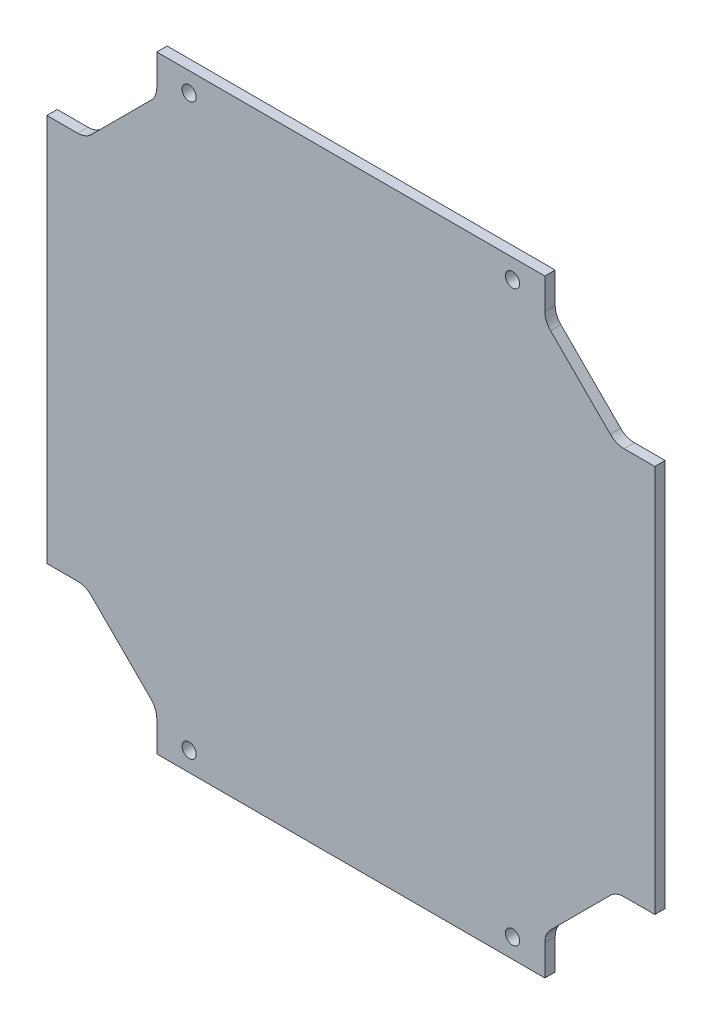
ISO-10303-21;
HEADER;
FILE_DESCRIPTION(('STEP AP214'),'2;1');
FILE_NAME('part.step','',(''),(''),'','','');
FILE_SCHEMA(('AUTOMOTIVE_DESIGN { 1 0 10303 214 1 1 1 1 }'));
ENDSEC;
DATA;
#1=APPLICATION_CONTEXT('core data for automotive mechanical design processes');
#2=APPLICATION_PROTOCOL_DEFINITION('international standard','automotive_design',2000,#1);
#3=PRODUCT_CONTEXT('',#1,'mechanical');
#4=PRODUCT('Part','Part','',(#3));
#5=PRODUCT_RELATED_PRODUCT_CATEGORY('part','',(#4));
#6=PRODUCT_DEFINITION_FORMATION('','',#4);
#7=PRODUCT_DEFINITION_CONTEXT('part definition',#1,'design');
#8=PRODUCT_DEFINITION('design','',#6,#7);
#9=PRODUCT_DEFINITION_SHAPE('','',#8);
#10=(LENGTH_UNIT() NAMED_UNIT(*) SI_UNIT(.MILLI.,.METRE.));
#11=(NAMED_UNIT(*) PLANE_ANGLE_UNIT() SI_UNIT($,.RADIAN.));
#12=(NAMED_UNIT(*) SI_UNIT($,.STERADIAN.) SOLID_ANGLE_UNIT());
#13=UNCERTAINTY_MEASURE_WITH_UNIT(LENGTH_MEASURE(1.E-05),#10,'distance_accuracy_value','');
#14=(GEOMETRIC_REPRESENTATION_CONTEXT(3) GLOBAL_UNCERTAINTY_ASSIGNED_CONTEXT((#13)) GLOBAL_UNIT_ASSIGNED_CONTEXT((#10,
#11,#12)) REPRESENTATION_CONTEXT('',''));
#15=CARTESIAN_POINT('',(0.,0.,0.));
#16=DIRECTION('',(0.,0.,1.));
#17=DIRECTION('',(1.,0.,0.));
#18=AXIS2_PLACEMENT_3D('',#15,#16,#17);
#19=CARTESIAN_POINT('',(-69.5653438799531,14.9518569300748,1.6));
#20=DIRECTION('',(0.,0.,-1.));
#21=DIRECTION('',(-1.,0.,0.));
#22=AXIS2_PLACEMENT_3D('',#19,#20,#21);
#23=PLANE('',#22);
#24=CARTESIAN_POINT('',(-14.5653438799531,88.9518569300749,1.6));
#25=DIRECTION('',(0.,0.,1.));
#26=DIRECTION('',(1.,0.,0.));
#27=AXIS2_PLACEMENT_3D('',#24,#25,#26);
#28=CIRCLE('',#27,1.1);
#29=CARTESIAN_POINT('',(-13.4653438799531,88.9518569300749,1.6));
#30=VERTEX_POINT('',#29);
#31=EDGE_CURVE('E730',#30,#30,#28,.T.);
#32=ORIENTED_EDGE('',*,*,#31,.F.);
#33=EDGE_LOOP('',(#32));
#34=FACE_BOUND('',#33,.T.);
#35=CARTESIAN_POINT('',(-64.5653438799532,88.9518569300749,1.6));
#36=DIRECTION('',(0.,0.,1.));
#37=DIRECTION('',(1.,0.,0.));
#38=AXIS2_PLACEMENT_3D('',#35,#36,#37);
#39=CIRCLE('',#38,1.10000000000001);
#40=CARTESIAN_POINT('',(-63.4653438799532,88.9518569300749,1.6));
#41=VERTEX_POINT('',#40);
#42=EDGE_CURVE('E257',#41,#41,#39,.T.);
#43=ORIENTED_EDGE('',*,*,#42,.F.);
#44=EDGE_LOOP('',(#43));
#45=FACE_BOUND('',#44,.T.);
#46=DIRECTION('',(1.,0.,0.));
#47=VECTOR('',#46,1.);
#48=CARTESIAN_POINT('',(-86.5653438799531,14.9518569300748,1.6));
#49=LINE('',#48,#47);
#50=CARTESIAN_POINT('',(-86.5653438799531,14.9518569300748,1.6));
#51=VERTEX_POINT('',#50);
#52=CARTESIAN_POINT('',(-81.8079845670724,14.9518569300748,1.6));
#53=VERTEX_POINT('',#52);
#54=EDGE_CURVE('E292',#51,#53,#49,.T.);
#55=ORIENTED_EDGE('',*,*,#54,.T.);
#56=CARTESIAN_POINT('',(-81.8079845670724,11.9518569300748,1.6));
#57=DIRECTION('',(0.,0.,-1.));
#58=DIRECTION('',(-1.,0.,0.));
#59=AXIS2_PLACEMENT_3D('',#56,#57,#58);
#60=CIRCLE('',#59,3.);
#61=CARTESIAN_POINT('',(-79.6866642235128,14.0731772736345,1.6));
#62=VERTEX_POINT('',#61);
#63=EDGE_CURVE('E350',#53,#62,#60,.T.);
#64=ORIENTED_EDGE('',*,*,#63,.T.);
#65=DIRECTION('',(0.707106781186547,-0.707106781186547,0.));
#66=VECTOR('',#65,1.);
#67=CARTESIAN_POINT('',(-80.5653438799531,14.9518569300748,1.6));
#68=LINE('',#67,#66);
#69=CARTESIAN_POINT('',(-70.4440235363935,4.83053658651517,1.6));
#70=VERTEX_POINT('',#69);
#71=EDGE_CURVE('E206',#62,#70,#68,.T.);
#72=ORIENTED_EDGE('',*,*,#71,.T.);
#73=CARTESIAN_POINT('',(-72.5653438799532,2.70921624295552,1.6));
#74=DIRECTION('',(0.,0.,-1.));
#75=DIRECTION('',(-1.,0.,0.));
#76=AXIS2_PLACEMENT_3D('',#73,#74,#75);
#77=CIRCLE('',#76,3.);
#78=CARTESIAN_POINT('',(-69.5653438799531,2.70921624295552,1.6));
#79=VERTEX_POINT('',#78);
#80=EDGE_CURVE('E202',#70,#79,#77,.T.);
#81=ORIENTED_EDGE('',*,*,#80,.T.);
#82=DIRECTION('',(0.,-1.,0.));
#83=VECTOR('',#82,1.);
#84=CARTESIAN_POINT('',(-69.5653438799531,3.95185693007481,1.6));
#85=LINE('',#84,#83);
#86=CARTESIAN_POINT('',(-69.5653438799531,-2.04814306992522,1.6));
#87=VERTEX_POINT('',#86);
#88=EDGE_CURVE('E192',#79,#87,#85,.T.);
#89=ORIENTED_EDGE('',*,*,#88,.T.);
#90=DIRECTION('',(1.,0.,0.));
#91=VECTOR('',#90,1.);
#92=CARTESIAN_POINT('',(-69.5653438799531,-2.04814306992522,1.6));
#93=LINE('',#92,#91);
#94=CARTESIAN_POINT('',(-9.56534387995308,-2.04814306992519,1.6));
#95=VERTEX_POINT('',#94);
#96=EDGE_CURVE('E198',#87,#95,#93,.T.);
#97=ORIENTED_EDGE('',*,*,#96,.T.);
#98=DIRECTION('',(0.,1.,0.));
#99=VECTOR('',#98,1.);
#100=CARTESIAN_POINT('',(-9.56534387995305,3.95185693007478,1.6));
#101=LINE('',#100,#99);
#102=CARTESIAN_POINT('',(-9.56534387995306,2.70921624295551,1.6));
#103=VERTEX_POINT('',#102);
#104=EDGE_CURVE('E221',#95,#103,#101,.T.);
#105=ORIENTED_EDGE('',*,*,#104,.T.);
#106=CARTESIAN_POINT('',(-6.56534387995306,2.7092162429555,1.6));
#107=DIRECTION('',(0.,0.,-1.));
#108=DIRECTION('',(-1.,0.,0.));
#109=AXIS2_PLACEMENT_3D('',#106,#107,#108);
#110=CIRCLE('',#109,3.);
#111=CARTESIAN_POINT('',(-8.68666422351271,4.83053658651513,1.6));
#112=VERTEX_POINT('',#111);
#113=EDGE_CURVE('E357',#103,#112,#110,.T.);
#114=ORIENTED_EDGE('',*,*,#113,.T.);
#115=DIRECTION('',(0.707106781186545,0.70710678118655,0.));
#116=VECTOR('',#115,1.);
#117=CARTESIAN_POINT('',(-9.56534387995305,3.95185693007478,1.6));
#118=LINE('',#117,#116);
#119=CARTESIAN_POINT('',(0.555976463606556,14.0731772736345,1.6));
#120=VERTEX_POINT('',#119);
#121=EDGE_CURVE('E223',#112,#120,#118,.T.);
#122=ORIENTED_EDGE('',*,*,#121,.T.);
#123=CARTESIAN_POINT('',(2.67729680716621,11.9518569300748,1.6));
#124=DIRECTION('',(0.,0.,-1.));
#125=DIRECTION('',(-1.,0.,0.));
#126=AXIS2_PLACEMENT_3D('',#123,#124,#125);
#127=CIRCLE('',#126,3.);
#128=CARTESIAN_POINT('',(2.67729680716621,14.9518569300748,1.6));
#129=VERTEX_POINT('',#128);
#130=EDGE_CURVE('E361',#120,#129,#127,.T.);
#131=ORIENTED_EDGE('',*,*,#130,.T.);
#132=DIRECTION('',(1.,0.,0.));
#133=VECTOR('',#132,1.);
#134=CARTESIAN_POINT('',(7.43465612004692,14.9518569300748,1.6));
#135=LINE('',#134,#133);
#136=CARTESIAN_POINT('',(7.43465612004692,14.9518569300748,1.6));
#137=VERTEX_POINT('',#136);
#138=EDGE_CURVE('E229',#129,#137,#135,.T.);
#139=ORIENTED_EDGE('',*,*,#138,.T.);
#140=DIRECTION('',(0.,1.,0.));
#141=VECTOR('',#140,1.);
#142=CARTESIAN_POINT('',(7.43465612004692,74.9518569300749,1.6));
#143=LINE('',#142,#141);
#144=CARTESIAN_POINT('',(7.43465612004692,74.9518569300749,1.6));
#145=VERTEX_POINT('',#144);
#146=EDGE_CURVE('E231',#137,#145,#143,.T.);
#147=ORIENTED_EDGE('',*,*,#146,.T.);
#148=DIRECTION('',(-1.,0.,0.));
#149=VECTOR('',#148,1.);
#150=CARTESIAN_POINT('',(1.43465612004691,74.9518569300749,1.6));
#151=LINE('',#150,#149);
#152=CARTESIAN_POINT('',(2.67729680716619,74.9518569300749,1.6));
#153=VERTEX_POINT('',#152);
#154=EDGE_CURVE('E233',#145,#153,#151,.T.);
#155=ORIENTED_EDGE('',*,*,#154,.T.);
#156=CARTESIAN_POINT('',(2.67729680716619,77.9518569300749,1.6));
#157=DIRECTION('',(0.,0.,-1.));
#158=DIRECTION('',(-1.,0.,0.));
#159=AXIS2_PLACEMENT_3D('',#156,#157,#158);
#160=CIRCLE('',#159,3.);
#161=CARTESIAN_POINT('',(0.555976463606544,75.8305365865153,1.6));
#162=VERTEX_POINT('',#161);
#163=EDGE_CURVE('E369',#153,#162,#160,.T.);
#164=ORIENTED_EDGE('',*,*,#163,.T.);
#165=DIRECTION('',(-0.707106781186547,0.707106781186548,0.));
#166=VECTOR('',#165,1.);
#167=CARTESIAN_POINT('',(-9.56534387995309,85.9518569300749,1.6));
#168=LINE('',#167,#166);
#169=CARTESIAN_POINT('',(-8.68666422351274,85.0731772736346,1.6));
#170=VERTEX_POINT('',#169);
#171=EDGE_CURVE('E236',#162,#170,#168,.T.);
#172=ORIENTED_EDGE('',*,*,#171,.T.);
#173=CARTESIAN_POINT('',(-6.56534387995309,87.1944976171942,1.6));
#174=DIRECTION('',(0.,0.,-1.));
#175=DIRECTION('',(-1.,0.,0.));
#176=AXIS2_PLACEMENT_3D('',#173,#174,#175);
#177=CIRCLE('',#176,3.);
#178=CARTESIAN_POINT('',(-9.56534387995309,87.1944976171942,1.6));
#179=VERTEX_POINT('',#178);
#180=EDGE_CURVE('E365',#170,#179,#177,.T.);
#181=ORIENTED_EDGE('',*,*,#180,.T.);
#182=DIRECTION('',(0.,1.,0.));
#183=VECTOR('',#182,1.);
#184=CARTESIAN_POINT('',(-9.56534387995309,91.9518569300749,1.6));
#185=LINE('',#184,#183);
#186=CARTESIAN_POINT('',(-9.56534387995309,91.9518569300749,1.6));
#187=VERTEX_POINT('',#186);
#188=EDGE_CURVE('E239',#179,#187,#185,.T.);
#189=ORIENTED_EDGE('',*,*,#188,.T.);
#190=DIRECTION('',(-1.,0.,0.));
#191=VECTOR('',#190,1.);
#192=CARTESIAN_POINT('',(-69.5653438799531,91.9518569300749,1.6));
#193=LINE('',#192,#191);
#194=CARTESIAN_POINT('',(-69.5653438799531,91.9518569300749,1.6));
#195=VERTEX_POINT('',#194);
#196=EDGE_CURVE('E241',#187,#195,#193,.T.);
#197=ORIENTED_EDGE('',*,*,#196,.T.);
#198=DIRECTION('',(0.,-1.,0.));
#199=VECTOR('',#198,1.);
#200=CARTESIAN_POINT('',(-69.5653438799531,85.9518569300749,1.6));
#201=LINE('',#200,#199);
#202=CARTESIAN_POINT('',(-69.5653438799531,87.1944976171942,1.6));
#203=VERTEX_POINT('',#202);
#204=EDGE_CURVE('E243',#195,#203,#201,.T.);
#205=ORIENTED_EDGE('',*,*,#204,.T.);
#206=CARTESIAN_POINT('',(-72.5653438799532,87.1944976171942,1.6));
#207=DIRECTION('',(0.,0.,-1.));
#208=DIRECTION('',(-1.,0.,0.));
#209=AXIS2_PLACEMENT_3D('',#206,#207,#208);
#210=CIRCLE('',#209,3.);
#211=CARTESIAN_POINT('',(-70.4440235363935,85.0731772736345,1.6));
#212=VERTEX_POINT('',#211);
#213=EDGE_CURVE('E11',#203,#212,#210,.T.);
#214=ORIENTED_EDGE('',*,*,#213,.T.);
#215=DIRECTION('',(-0.707106781186547,-0.707106781186547,0.));
#216=VECTOR('',#215,1.);
#217=CARTESIAN_POINT('',(-80.5653438799531,74.9518569300749,1.6));
#218=LINE('',#217,#216);
#219=CARTESIAN_POINT('',(-79.6866642235128,75.8305365865153,1.6));
#220=VERTEX_POINT('',#219);
#221=EDGE_CURVE('E245',#212,#220,#218,.T.);
#222=ORIENTED_EDGE('',*,*,#221,.T.);
#223=CARTESIAN_POINT('',(-81.8079845670724,77.9518569300749,1.6));
#224=DIRECTION('',(0.,0.,-1.));
#225=DIRECTION('',(-1.,0.,0.));
#226=AXIS2_PLACEMENT_3D('',#223,#224,#225);
#227=CIRCLE('',#226,3.);
#228=CARTESIAN_POINT('',(-81.8079845670724,74.9518569300749,1.6));
#229=VERTEX_POINT('',#228);
#230=EDGE_CURVE('E373',#220,#229,#227,.T.);
#231=ORIENTED_EDGE('',*,*,#230,.T.);
#232=DIRECTION('',(-1.,0.,0.));
#233=VECTOR('',#232,1.);
#234=CARTESIAN_POINT('',(-86.5653438799532,74.9518569300749,1.6));
#235=LINE('',#234,#233);
#236=CARTESIAN_POINT('',(-86.5653438799532,74.9518569300749,1.6));
#237=VERTEX_POINT('',#236);
#238=EDGE_CURVE('E248',#229,#237,#235,.T.);
#239=ORIENTED_EDGE('',*,*,#238,.T.);
#240=DIRECTION('',(0.,-1.,0.));
#241=VECTOR('',#240,1.);
#242=CARTESIAN_POINT('',(-86.5653438799532,74.9518569300749,1.6));
#243=LINE('',#242,#241);
#244=EDGE_CURVE('E250',#237,#51,#243,.T.);
#245=ORIENTED_EDGE('',*,*,#244,.T.);
#246=EDGE_LOOP('',(#55,#64,#72,#81,#89,#97,#105,#114,#122,#131,#139,#147,#155,#164,#172,#181,
#189,#197,#205,#214,#222,#231,#239,#245));
#247=FACE_BOUND('',#246,.T.);
#248=CARTESIAN_POINT('',(-64.5653438799531,0.951856930074832,1.6));
#249=DIRECTION('',(0.,0.,1.));
#250=DIRECTION('',(1.,0.,0.));
#251=AXIS2_PLACEMENT_3D('',#248,#249,#250);
#252=CIRCLE('',#251,1.10000000000001);
#253=CARTESIAN_POINT('',(-63.4653438799531,0.951856930074832,1.6));
#254=VERTEX_POINT('',#253);
#255=EDGE_CURVE('E724',#254,#254,#252,.T.);
#256=ORIENTED_EDGE('',*,*,#255,.F.);
#257=EDGE_LOOP('',(#256));
#258=FACE_BOUND('',#257,.T.);
#259=CARTESIAN_POINT('',(-14.5653438799531,0.951856930074832,1.6));
#260=DIRECTION('',(0.,0.,1.));
#261=DIRECTION('',(1.,0.,0.));
#262=AXIS2_PLACEMENT_3D('',#259,#260,#261);
#263=CIRCLE('',#262,1.1);
#264=CARTESIAN_POINT('',(-13.4653438799531,0.951856930074832,1.6));
#265=VERTEX_POINT('',#264);
#266=EDGE_CURVE('E736',#265,#265,#263,.T.);
#267=ORIENTED_EDGE('',*,*,#266,.F.);
#268=EDGE_LOOP('',(#267));
#269=FACE_BOUND('',#268,.T.);
#270=ADVANCED_FACE('F32',(#34,#45,#247,#258,#269),#23,.F.);
#271=CARTESIAN_POINT('',(-69.5653438799531,14.9518569300748,0.));
#272=DIRECTION('',(0.,0.,-1.));
#273=DIRECTION('',(-1.,0.,0.));
#274=AXIS2_PLACEMENT_3D('',#271,#272,#273);
#275=PLANE('',#274);
#276=CARTESIAN_POINT('',(-14.5653438799531,88.9518569300749,0.));
#277=DIRECTION('',(0.,0.,1.));
#278=DIRECTION('',(1.,0.,0.));
#279=AXIS2_PLACEMENT_3D('',#276,#277,#278);
#280=CIRCLE('',#279,1.1);
#281=CARTESIAN_POINT('',(-13.4653438799531,88.9518569300749,0.));
#282=VERTEX_POINT('',#281);
#283=EDGE_CURVE('E733',#282,#282,#280,.T.);
#284=ORIENTED_EDGE('',*,*,#283,.T.);
#285=EDGE_LOOP('',(#284));
#286=FACE_BOUND('',#285,.T.);
#287=CARTESIAN_POINT('',(-64.5653438799532,88.9518569300749,0.));
#288=DIRECTION('',(0.,0.,1.));
#289=DIRECTION('',(1.,0.,0.));
#290=AXIS2_PLACEMENT_3D('',#287,#288,#289);
#291=CIRCLE('',#290,1.10000000000001);
#292=CARTESIAN_POINT('',(-63.4653438799532,88.9518569300749,0.));
#293=VERTEX_POINT('',#292);
#294=EDGE_CURVE('E721',#293,#293,#291,.T.);
#295=ORIENTED_EDGE('',*,*,#294,.T.);
#296=EDGE_LOOP('',(#295));
#297=FACE_BOUND('',#296,.T.);
#298=DIRECTION('',(1.,0.,0.));
#299=VECTOR('',#298,1.);
#300=CARTESIAN_POINT('',(-86.5653438799531,14.9518569300748,0.));
#301=LINE('',#300,#299);
#302=CARTESIAN_POINT('',(-86.5653438799531,14.9518569300748,0.));
#303=VERTEX_POINT('',#302);
#304=CARTESIAN_POINT('',(-81.8079845670724,14.9518569300748,0.));
#305=VERTEX_POINT('',#304);
#306=EDGE_CURVE('E253',#303,#305,#301,.T.);
#307=ORIENTED_EDGE('',*,*,#306,.F.);
#308=DIRECTION('',(0.,-1.,0.));
#309=VECTOR('',#308,1.);
#310=CARTESIAN_POINT('',(-86.5653438799532,74.9518569300749,0.));
#311=LINE('',#310,#309);
#312=CARTESIAN_POINT('',(-86.5653438799532,74.9518569300749,0.));
#313=VERTEX_POINT('',#312);
#314=EDGE_CURVE('E290',#313,#303,#311,.T.);
#315=ORIENTED_EDGE('',*,*,#314,.F.);
#316=DIRECTION('',(-1.,0.,0.));
#317=VECTOR('',#316,1.);
#318=CARTESIAN_POINT('',(-86.5653438799532,74.9518569300749,0.));
#319=LINE('',#318,#317);
#320=CARTESIAN_POINT('',(-81.8079845670724,74.9518569300749,0.));
#321=VERTEX_POINT('',#320);
#322=EDGE_CURVE('E288',#321,#313,#319,.T.);
#323=ORIENTED_EDGE('',*,*,#322,.F.);
#324=CARTESIAN_POINT('',(-81.8079845670724,77.9518569300749,0.));
#325=DIRECTION('',(0.,0.,-1.));
#326=DIRECTION('',(-1.,0.,0.));
#327=AXIS2_PLACEMENT_3D('',#324,#325,#326);
#328=CIRCLE('',#327,3.);
#329=CARTESIAN_POINT('',(-79.6866642235128,75.8305365865153,0.));
#330=VERTEX_POINT('',#329);
#331=EDGE_CURVE('E371',#321,#330,#328,.F.);
#332=ORIENTED_EDGE('',*,*,#331,.T.);
#333=DIRECTION('',(-0.707106781186547,-0.707106781186547,0.));
#334=VECTOR('',#333,1.);
#335=CARTESIAN_POINT('',(-80.5653438799531,74.9518569300749,0.));
#336=LINE('',#335,#334);
#337=CARTESIAN_POINT('',(-70.4440235363935,85.0731772736345,0.));
#338=VERTEX_POINT('',#337);
#339=EDGE_CURVE('E285',#338,#330,#336,.T.);
#340=ORIENTED_EDGE('',*,*,#339,.F.);
#341=CARTESIAN_POINT('',(-72.5653438799532,87.1944976171942,0.));
#342=DIRECTION('',(0.,0.,-1.));
#343=DIRECTION('',(-1.,0.,0.));
#344=AXIS2_PLACEMENT_3D('',#341,#342,#343);
#345=CIRCLE('',#344,3.);
#346=CARTESIAN_POINT('',(-69.5653438799531,87.1944976171942,0.));
#347=VERTEX_POINT('',#346);
#348=EDGE_CURVE('E40',#338,#347,#345,.F.);
#349=ORIENTED_EDGE('',*,*,#348,.T.);
#350=DIRECTION('',(0.,-1.,0.));
#351=VECTOR('',#350,1.);
#352=CARTESIAN_POINT('',(-69.5653438799531,85.9518569300749,0.));
#353=LINE('',#352,#351);
#354=CARTESIAN_POINT('',(-69.5653438799531,91.9518569300749,0.));
#355=VERTEX_POINT('',#354);
#356=EDGE_CURVE('E283',#355,#347,#353,.T.);
#357=ORIENTED_EDGE('',*,*,#356,.F.);
#358=DIRECTION('',(-1.,0.,0.));
#359=VECTOR('',#358,1.);
#360=CARTESIAN_POINT('',(-69.5653438799531,91.9518569300749,0.));
#361=LINE('',#360,#359);
#362=CARTESIAN_POINT('',(-9.56534387995309,91.9518569300749,0.));
#363=VERTEX_POINT('',#362);
#364=EDGE_CURVE('E281',#363,#355,#361,.T.);
#365=ORIENTED_EDGE('',*,*,#364,.F.);
#366=DIRECTION('',(0.,1.,0.));
#367=VECTOR('',#366,1.);
#368=CARTESIAN_POINT('',(-9.56534387995309,91.9518569300749,0.));
#369=LINE('',#368,#367);
#370=CARTESIAN_POINT('',(-9.56534387995309,87.1944976171942,0.));
#371=VERTEX_POINT('',#370);
#372=EDGE_CURVE('E279',#371,#363,#369,.T.);
#373=ORIENTED_EDGE('',*,*,#372,.F.);
#374=CARTESIAN_POINT('',(-6.56534387995309,87.1944976171942,0.));
#375=DIRECTION('',(0.,0.,-1.));
#376=DIRECTION('',(-1.,0.,0.));
#377=AXIS2_PLACEMENT_3D('',#374,#375,#376);
#378=CIRCLE('',#377,3.);
#379=CARTESIAN_POINT('',(-8.68666422351274,85.0731772736346,0.));
#380=VERTEX_POINT('',#379);
#381=EDGE_CURVE('E363',#371,#380,#378,.F.);
#382=ORIENTED_EDGE('',*,*,#381,.T.);
#383=DIRECTION('',(-0.707106781186547,0.707106781186548,0.));
#384=VECTOR('',#383,1.);
#385=CARTESIAN_POINT('',(-9.56534387995309,85.9518569300749,0.));
#386=LINE('',#385,#384);
#387=CARTESIAN_POINT('',(0.555976463606544,75.8305365865153,0.));
#388=VERTEX_POINT('',#387);
#389=EDGE_CURVE('E276',#388,#380,#386,.T.);
#390=ORIENTED_EDGE('',*,*,#389,.F.);
#391=CARTESIAN_POINT('',(2.67729680716619,77.9518569300749,0.));
#392=DIRECTION('',(0.,0.,-1.));
#393=DIRECTION('',(-1.,0.,0.));
#394=AXIS2_PLACEMENT_3D('',#391,#392,#393);
#395=CIRCLE('',#394,3.);
#396=CARTESIAN_POINT('',(2.67729680716619,74.9518569300749,0.));
#397=VERTEX_POINT('',#396);
#398=EDGE_CURVE('E367',#388,#397,#395,.F.);
#399=ORIENTED_EDGE('',*,*,#398,.T.);
#400=DIRECTION('',(-1.,0.,0.));
#401=VECTOR('',#400,1.);
#402=CARTESIAN_POINT('',(1.43465612004691,74.9518569300749,0.));
#403=LINE('',#402,#401);
#404=CARTESIAN_POINT('',(7.43465612004692,74.9518569300749,0.));
#405=VERTEX_POINT('',#404);
#406=EDGE_CURVE('E273',#405,#397,#403,.T.);
#407=ORIENTED_EDGE('',*,*,#406,.F.);
#408=DIRECTION('',(0.,1.,0.));
#409=VECTOR('',#408,1.);
#410=CARTESIAN_POINT('',(7.43465612004692,74.9518569300749,0.));
#411=LINE('',#410,#409);
#412=CARTESIAN_POINT('',(7.43465612004692,14.9518569300748,0.));
#413=VERTEX_POINT('',#412);
#414=EDGE_CURVE('E271',#413,#405,#411,.T.);
#415=ORIENTED_EDGE('',*,*,#414,.F.);
#416=DIRECTION('',(1.,0.,0.));
#417=VECTOR('',#416,1.);
#418=CARTESIAN_POINT('',(7.43465612004692,14.9518569300748,0.));
#419=LINE('',#418,#417);
#420=CARTESIAN_POINT('',(2.67729680716621,14.9518569300748,0.));
#421=VERTEX_POINT('',#420);
#422=EDGE_CURVE('E269',#421,#413,#419,.T.);
#423=ORIENTED_EDGE('',*,*,#422,.F.);
#424=CARTESIAN_POINT('',(2.67729680716621,11.9518569300748,0.));
#425=DIRECTION('',(0.,0.,-1.));
#426=DIRECTION('',(-1.,0.,0.));
#427=AXIS2_PLACEMENT_3D('',#424,#425,#426);
#428=CIRCLE('',#427,3.);
#429=CARTESIAN_POINT('',(0.555976463606556,14.0731772736345,0.));
#430=VERTEX_POINT('',#429);
#431=EDGE_CURVE('E359',#421,#430,#428,.F.);
#432=ORIENTED_EDGE('',*,*,#431,.T.);
#433=DIRECTION('',(0.707106781186545,0.70710678118655,0.));
#434=VECTOR('',#433,1.);
#435=CARTESIAN_POINT('',(-9.56534387995305,3.95185693007478,0.));
#436=LINE('',#435,#434);
#437=CARTESIAN_POINT('',(-8.68666422351271,4.83053658651513,0.));
#438=VERTEX_POINT('',#437);
#439=EDGE_CURVE('E266',#438,#430,#436,.T.);
#440=ORIENTED_EDGE('',*,*,#439,.F.);
#441=CARTESIAN_POINT('',(-6.56534387995306,2.7092162429555,0.));
#442=DIRECTION('',(0.,0.,-1.));
#443=DIRECTION('',(-1.,0.,0.));
#444=AXIS2_PLACEMENT_3D('',#441,#442,#443);
#445=CIRCLE('',#444,3.);
#446=CARTESIAN_POINT('',(-9.56534387995306,2.70921624295551,0.));
#447=VERTEX_POINT('',#446);
#448=EDGE_CURVE('E355',#438,#447,#445,.F.);
#449=ORIENTED_EDGE('',*,*,#448,.T.);
#450=DIRECTION('',(0.,1.,0.));
#451=VECTOR('',#450,1.);
#452=CARTESIAN_POINT('',(-9.56534387995305,3.95185693007478,0.));
#453=LINE('',#452,#451);
#454=CARTESIAN_POINT('',(-9.56534387995308,-2.04814306992519,0.));
#455=VERTEX_POINT('',#454);
#456=EDGE_CURVE('E263',#455,#447,#453,.T.);
#457=ORIENTED_EDGE('',*,*,#456,.F.);
#458=DIRECTION('',(1.,0.,0.));
#459=VECTOR('',#458,1.);
#460=CARTESIAN_POINT('',(-69.5653438799531,-2.04814306992522,0.));
#461=LINE('',#460,#459);
#462=CARTESIAN_POINT('',(-69.5653438799531,-2.04814306992522,0.));
#463=VERTEX_POINT('',#462);
#464=EDGE_CURVE('E261',#463,#455,#461,.T.);
#465=ORIENTED_EDGE('',*,*,#464,.F.);
#466=DIRECTION('',(0.,-1.,0.));
#467=VECTOR('',#466,1.);
#468=CARTESIAN_POINT('',(-69.5653438799531,3.95185693007481,0.));
#469=LINE('',#468,#467);
#470=CARTESIAN_POINT('',(-69.5653438799531,2.70921624295552,0.));
#471=VERTEX_POINT('',#470);
#472=EDGE_CURVE('E212',#471,#463,#469,.T.);
#473=ORIENTED_EDGE('',*,*,#472,.F.);
#474=CARTESIAN_POINT('',(-72.5653438799532,2.70921624295552,0.));
#475=DIRECTION('',(0.,0.,-1.));
#476=DIRECTION('',(-1.,0.,0.));
#477=AXIS2_PLACEMENT_3D('',#474,#475,#476);
#478=CIRCLE('',#477,3.);
#479=CARTESIAN_POINT('',(-70.4440235363935,4.83053658651517,0.));
#480=VERTEX_POINT('',#479);
#481=EDGE_CURVE('E352',#471,#480,#478,.F.);
#482=ORIENTED_EDGE('',*,*,#481,.T.);
#483=DIRECTION('',(0.707106781186547,-0.707106781186547,0.));
#484=VECTOR('',#483,1.);
#485=CARTESIAN_POINT('',(-80.5653438799531,14.9518569300748,0.));
#486=LINE('',#485,#484);
#487=CARTESIAN_POINT('',(-79.6866642235128,14.0731772736345,0.));
#488=VERTEX_POINT('',#487);
#489=EDGE_CURVE('E256',#488,#480,#486,.T.);
#490=ORIENTED_EDGE('',*,*,#489,.F.);
#491=CARTESIAN_POINT('',(-81.8079845670724,11.9518569300748,0.));
#492=DIRECTION('',(0.,0.,-1.));
#493=DIRECTION('',(-1.,0.,0.));
#494=AXIS2_PLACEMENT_3D('',#491,#492,#493);
#495=CIRCLE('',#494,3.);
#496=EDGE_CURVE('E348',#488,#305,#495,.F.);
#497=ORIENTED_EDGE('',*,*,#496,.T.);
#498=EDGE_LOOP('',(#307,#315,#323,#332,#340,#349,#357,#365,#373,#382,#390,#399,#407,#415,#423,
#432,#440,#449,#457,#465,#473,#482,#490,#497));
#499=FACE_BOUND('',#498,.T.);
#500=CARTESIAN_POINT('',(-64.5653438799531,0.951856930074832,0.));
#501=DIRECTION('',(0.,0.,1.));
#502=DIRECTION('',(1.,0.,0.));
#503=AXIS2_PLACEMENT_3D('',#500,#501,#502);
#504=CIRCLE('',#503,1.10000000000001);
#505=CARTESIAN_POINT('',(-63.4653438799531,0.951856930074832,0.));
#506=VERTEX_POINT('',#505);
#507=EDGE_CURVE('E727',#506,#506,#504,.T.);
#508=ORIENTED_EDGE('',*,*,#507,.T.);
#509=EDGE_LOOP('',(#508));
#510=FACE_BOUND('',#509,.T.);
#511=CARTESIAN_POINT('',(-14.5653438799531,0.951856930074832,0.));
#512=DIRECTION('',(0.,0.,1.));
#513=DIRECTION('',(1.,0.,0.));
#514=AXIS2_PLACEMENT_3D('',#511,#512,#513);
#515=CIRCLE('',#514,1.1);
#516=CARTESIAN_POINT('',(-13.4653438799531,0.951856930074832,0.));
#517=VERTEX_POINT('',#516);
#518=EDGE_CURVE('E739',#517,#517,#515,.T.);
#519=ORIENTED_EDGE('',*,*,#518,.T.);
#520=EDGE_LOOP('',(#519));
#521=FACE_BOUND('',#520,.T.);
#522=ADVANCED_FACE('F387',(#286,#297,#499,#510,#521),#275,.T.);
#523=CARTESIAN_POINT('',(-86.5653438799531,14.9518569300748,1.6));
#524=DIRECTION('',(0.,1.,0.));
#525=DIRECTION('',(0.,0.,1.));
#526=AXIS2_PLACEMENT_3D('',#523,#524,#525);
#527=PLANE('',#526);
#528=ORIENTED_EDGE('',*,*,#306,.T.);
#529=DIRECTION('',(0.,0.,-1.));
#530=VECTOR('',#529,1.);
#531=CARTESIAN_POINT('',(-81.8079845670724,14.9518569300748,1.6));
#532=LINE('',#531,#530);
#533=EDGE_CURVE('E315',#305,#53,#532,.F.);
#534=ORIENTED_EDGE('',*,*,#533,.T.);
#535=ORIENTED_EDGE('',*,*,#54,.F.);
#536=DIRECTION('',(0.,0.,-1.));
#537=VECTOR('',#536,1.);
#538=CARTESIAN_POINT('',(-86.5653438799531,14.9518569300748,1.6));
#539=LINE('',#538,#537);
#540=EDGE_CURVE('E252',#51,#303,#539,.T.);
#541=ORIENTED_EDGE('',*,*,#540,.T.);
#542=EDGE_LOOP('',(#528,#534,#535,#541));
#543=FACE_BOUND('',#542,.T.);
#544=ADVANCED_FACE('F465',(#543),#527,.F.);
#545=CARTESIAN_POINT('',(-80.5653438799531,14.9518569300748,1.6));
#546=DIRECTION('',(0.707106781186548,0.707106781186548,0.));
#547=DIRECTION('',(-0.707106781186548,0.707106781186548,0.));
#548=AXIS2_PLACEMENT_3D('',#545,#546,#547);
#549=PLANE('',#548);
#550=ORIENTED_EDGE('',*,*,#71,.F.);
#551=DIRECTION('',(0.,0.,-1.));
#552=VECTOR('',#551,1.);
#553=CARTESIAN_POINT('',(-79.6866642235128,14.0731772736345,0.));
#554=LINE('',#553,#552);
#555=EDGE_CURVE('E312',#62,#488,#554,.T.);
#556=ORIENTED_EDGE('',*,*,#555,.T.);
#557=ORIENTED_EDGE('',*,*,#489,.T.);
#558=DIRECTION('',(0.,0.,-1.));
#559=VECTOR('',#558,1.);
#560=CARTESIAN_POINT('',(-70.4440235363935,4.83053658651517,1.6));
#561=LINE('',#560,#559);
#562=EDGE_CURVE('E215',#480,#70,#561,.F.);
#563=ORIENTED_EDGE('',*,*,#562,.T.);
#564=EDGE_LOOP('',(#550,#556,#557,#563));
#565=FACE_BOUND('',#564,.T.);
#566=ADVANCED_FACE('F679',(#565),#549,.F.);
#567=CARTESIAN_POINT('',(-69.5653438799531,3.95185693007481,1.6));
#568=DIRECTION('',(1.,0.,0.));
#569=DIRECTION('',(0.,0.,-1.));
#570=AXIS2_PLACEMENT_3D('',#567,#568,#569);
#571=PLANE('',#570);
#572=ORIENTED_EDGE('',*,*,#88,.F.);
#573=DIRECTION('',(0.,0.,-1.));
#574=VECTOR('',#573,1.);
#575=CARTESIAN_POINT('',(-69.5653438799531,2.70921624295552,0.));
#576=LINE('',#575,#574);
#577=EDGE_CURVE('E317',#79,#471,#576,.T.);
#578=ORIENTED_EDGE('',*,*,#577,.T.);
#579=ORIENTED_EDGE('',*,*,#472,.T.);
#580=DIRECTION('',(0.,0.,-1.));
#581=VECTOR('',#580,1.);
#582=CARTESIAN_POINT('',(-69.5653438799531,-2.04814306992522,1.6));
#583=LINE('',#582,#581);
#584=EDGE_CURVE('E209',#87,#463,#583,.T.);
#585=ORIENTED_EDGE('',*,*,#584,.F.);
#586=EDGE_LOOP('',(#572,#578,#579,#585));
#587=FACE_BOUND('',#586,.T.);
#588=ADVANCED_FACE('F210',(#587),#571,.F.);
#589=CARTESIAN_POINT('',(-69.5653438799531,-2.04814306992522,1.6));
#590=DIRECTION('',(0.,1.,0.));
#591=DIRECTION('',(-1.,0.,0.));
#592=AXIS2_PLACEMENT_3D('',#589,#590,#591);
#593=PLANE('',#592);
#594=ORIENTED_EDGE('',*,*,#464,.T.);
#595=DIRECTION('',(0.,0.,-1.));
#596=VECTOR('',#595,1.);
#597=CARTESIAN_POINT('',(-9.56534387995308,-2.04814306992519,1.6));
#598=LINE('',#597,#596);
#599=EDGE_CURVE('E216',#95,#455,#598,.T.);
#600=ORIENTED_EDGE('',*,*,#599,.F.);
#601=ORIENTED_EDGE('',*,*,#96,.F.);
#602=ORIENTED_EDGE('',*,*,#584,.T.);
#603=EDGE_LOOP('',(#594,#600,#601,#602));
#604=FACE_BOUND('',#603,.T.);
#605=ADVANCED_FACE('F218',(#604),#593,.F.);
#606=CARTESIAN_POINT('',(-9.56534387995305,3.95185693007478,1.6));
#607=DIRECTION('',(-1.,0.,0.));
#608=DIRECTION('',(0.,-1.,0.));
#609=AXIS2_PLACEMENT_3D('',#606,#607,#608);
#610=PLANE('',#609);
#611=ORIENTED_EDGE('',*,*,#456,.T.);
#612=DIRECTION('',(0.,0.,-1.));
#613=VECTOR('',#612,1.);
#614=CARTESIAN_POINT('',(-9.56534387995306,2.70921624295551,1.6));
#615=LINE('',#614,#613);
#616=EDGE_CURVE('E324',#447,#103,#615,.F.);
#617=ORIENTED_EDGE('',*,*,#616,.T.);
#618=ORIENTED_EDGE('',*,*,#104,.F.);
#619=ORIENTED_EDGE('',*,*,#599,.T.);
#620=EDGE_LOOP('',(#611,#617,#618,#619));
#621=FACE_BOUND('',#620,.T.);
#622=ADVANCED_FACE('F450',(#621),#610,.F.);
#623=CARTESIAN_POINT('',(-9.56534387995305,3.95185693007478,1.6));
#624=DIRECTION('',(-0.70710678118655,0.707106781186545,0.));
#625=DIRECTION('',(-0.707106781186545,-0.70710678118655,0.));
#626=AXIS2_PLACEMENT_3D('',#623,#624,#625);
#627=PLANE('',#626);
#628=ORIENTED_EDGE('',*,*,#121,.F.);
#629=DIRECTION('',(0.,0.,-1.));
#630=VECTOR('',#629,1.);
#631=CARTESIAN_POINT('',(-8.68666422351271,4.83053658651513,0.));
#632=LINE('',#631,#630);
#633=EDGE_CURVE('E321',#112,#438,#632,.T.);
#634=ORIENTED_EDGE('',*,*,#633,.T.);
#635=ORIENTED_EDGE('',*,*,#439,.T.);
#636=DIRECTION('',(0.,0.,-1.));
#637=VECTOR('',#636,1.);
#638=CARTESIAN_POINT('',(0.555976463606558,14.0731772736345,1.6));
#639=LINE('',#638,#637);
#640=EDGE_CURVE('E319',#430,#120,#639,.F.);
#641=ORIENTED_EDGE('',*,*,#640,.T.);
#642=EDGE_LOOP('',(#628,#634,#635,#641));
#643=FACE_BOUND('',#642,.T.);
#644=ADVANCED_FACE('F442',(#643),#627,.F.);
#645=CARTESIAN_POINT('',(7.43465612004692,14.9518569300748,1.6));
#646=DIRECTION('',(0.,1.,0.));
#647=DIRECTION('',(0.,0.,1.));
#648=AXIS2_PLACEMENT_3D('',#645,#646,#647);
#649=PLANE('',#648);
#650=ORIENTED_EDGE('',*,*,#138,.F.);
#651=DIRECTION('',(0.,0.,-1.));
#652=VECTOR('',#651,1.);
#653=CARTESIAN_POINT('',(2.67729680716621,14.9518569300748,0.));
#654=LINE('',#653,#652);
#655=EDGE_CURVE('E326',#129,#421,#654,.T.);
#656=ORIENTED_EDGE('',*,*,#655,.T.);
#657=ORIENTED_EDGE('',*,*,#422,.T.);
#658=DIRECTION('',(0.,0.,-1.));
#659=VECTOR('',#658,1.);
#660=CARTESIAN_POINT('',(7.43465612004692,14.9518569300748,1.6));
#661=LINE('',#660,#659);
#662=EDGE_CURVE('E307',#137,#413,#661,.T.);
#663=ORIENTED_EDGE('',*,*,#662,.F.);
#664=EDGE_LOOP('',(#650,#656,#657,#663));
#665=FACE_BOUND('',#664,.T.);
#666=ADVANCED_FACE('F434',(#665),#649,.F.);
#667=CARTESIAN_POINT('',(7.43465612004692,74.9518569300749,1.6));
#668=DIRECTION('',(-1.,0.,0.));
#669=DIRECTION('',(0.,-1.,0.));
#670=AXIS2_PLACEMENT_3D('',#667,#668,#669);
#671=PLANE('',#670);
#672=ORIENTED_EDGE('',*,*,#414,.T.);
#673=DIRECTION('',(0.,0.,-1.));
#674=VECTOR('',#673,1.);
#675=CARTESIAN_POINT('',(7.43465612004692,74.9518569300749,1.6));
#676=LINE('',#675,#674);
#677=EDGE_CURVE('E304',#145,#405,#676,.T.);
#678=ORIENTED_EDGE('',*,*,#677,.F.);
#679=ORIENTED_EDGE('',*,*,#146,.F.);
#680=ORIENTED_EDGE('',*,*,#662,.T.);
#681=EDGE_LOOP('',(#672,#678,#679,#680));
#682=FACE_BOUND('',#681,.T.);
#683=ADVANCED_FACE('F428',(#682),#671,.F.);
#684=CARTESIAN_POINT('',(1.43465612004691,74.9518569300749,1.6));
#685=DIRECTION('',(0.,-1.,0.));
#686=DIRECTION('',(0.,0.,-1.));
#687=AXIS2_PLACEMENT_3D('',#684,#685,#686);
#688=PLANE('',#687);
#689=ORIENTED_EDGE('',*,*,#406,.T.);
#690=DIRECTION('',(0.,0.,-1.));
#691=VECTOR('',#690,1.);
#692=CARTESIAN_POINT('',(2.67729680716619,74.9518569300749,1.6));
#693=LINE('',#692,#691);
#694=EDGE_CURVE('E337',#397,#153,#693,.F.);
#695=ORIENTED_EDGE('',*,*,#694,.T.);
#696=ORIENTED_EDGE('',*,*,#154,.F.);
#697=ORIENTED_EDGE('',*,*,#677,.T.);
#698=EDGE_LOOP('',(#689,#695,#696,#697));
#699=FACE_BOUND('',#698,.T.);
#700=ADVANCED_FACE('F423',(#699),#688,.F.);
#701=CARTESIAN_POINT('',(-9.56534387995309,85.9518569300749,1.6));
#702=DIRECTION('',(-0.707106781186548,-0.707106781186547,0.));
#703=DIRECTION('',(0.707106781186547,-0.707106781186548,0.));
#704=AXIS2_PLACEMENT_3D('',#701,#702,#703);
#705=PLANE('',#704);
#706=ORIENTED_EDGE('',*,*,#389,.T.);
#707=DIRECTION('',(0.,0.,-1.));
#708=VECTOR('',#707,1.);
#709=CARTESIAN_POINT('',(-8.68666422351273,85.0731772736346,1.6));
#710=LINE('',#709,#708);
#711=EDGE_CURVE('E335',#380,#170,#710,.F.);
#712=ORIENTED_EDGE('',*,*,#711,.T.);
#713=ORIENTED_EDGE('',*,*,#171,.F.);
#714=DIRECTION('',(0.,0.,-1.));
#715=VECTOR('',#714,1.);
#716=CARTESIAN_POINT('',(0.555976463606545,75.8305365865153,0.));
#717=LINE('',#716,#715);
#718=EDGE_CURVE('E332',#162,#388,#717,.T.);
#719=ORIENTED_EDGE('',*,*,#718,.T.);
#720=EDGE_LOOP('',(#706,#712,#713,#719));
#721=FACE_BOUND('',#720,.T.);
#722=ADVANCED_FACE('F413',(#721),#705,.F.);
#723=CARTESIAN_POINT('',(-9.56534387995309,91.9518569300749,1.6));
#724=DIRECTION('',(-1.,0.,0.));
#725=DIRECTION('',(0.,-1.,0.));
#726=AXIS2_PLACEMENT_3D('',#723,#724,#725);
#727=PLANE('',#726);
#728=ORIENTED_EDGE('',*,*,#188,.F.);
#729=DIRECTION('',(0.,0.,-1.));
#730=VECTOR('',#729,1.);
#731=CARTESIAN_POINT('',(-9.56534387995309,87.1944976171942,0.));
#732=LINE('',#731,#730);
#733=EDGE_CURVE('E329',#179,#371,#732,.T.);
#734=ORIENTED_EDGE('',*,*,#733,.T.);
#735=ORIENTED_EDGE('',*,*,#372,.T.);
#736=DIRECTION('',(0.,0.,-1.));
#737=VECTOR('',#736,1.);
#738=CARTESIAN_POINT('',(-9.56534387995309,91.9518569300749,1.6));
#739=LINE('',#738,#737);
#740=EDGE_CURVE('E301',#187,#363,#739,.T.);
#741=ORIENTED_EDGE('',*,*,#740,.F.);
#742=EDGE_LOOP('',(#728,#734,#735,#741));
#743=FACE_BOUND('',#742,.T.);
#744=ADVANCED_FACE('F405',(#743),#727,.F.);
#745=CARTESIAN_POINT('',(-69.5653438799531,91.9518569300749,1.6));
#746=DIRECTION('',(0.,-1.,0.));
#747=DIRECTION('',(1.,0.,0.));
#748=AXIS2_PLACEMENT_3D('',#745,#746,#747);
#749=PLANE('',#748);
#750=ORIENTED_EDGE('',*,*,#364,.T.);
#751=DIRECTION('',(0.,0.,-1.));
#752=VECTOR('',#751,1.);
#753=CARTESIAN_POINT('',(-69.5653438799531,91.9518569300749,1.6));
#754=LINE('',#753,#752);
#755=EDGE_CURVE('E298',#195,#355,#754,.T.);
#756=ORIENTED_EDGE('',*,*,#755,.F.);
#757=ORIENTED_EDGE('',*,*,#196,.F.);
#758=ORIENTED_EDGE('',*,*,#740,.T.);
#759=EDGE_LOOP('',(#750,#756,#757,#758));
#760=FACE_BOUND('',#759,.T.);
#761=ADVANCED_FACE('F401',(#760),#749,.F.);
#762=CARTESIAN_POINT('',(-69.5653438799531,85.9518569300749,1.6));
#763=DIRECTION('',(1.,0.,0.));
#764=DIRECTION('',(0.,0.,-1.));
#765=AXIS2_PLACEMENT_3D('',#762,#763,#764);
#766=PLANE('',#765);
#767=ORIENTED_EDGE('',*,*,#356,.T.);
#768=DIRECTION('',(0.,0.,-1.));
#769=VECTOR('',#768,1.);
#770=CARTESIAN_POINT('',(-69.5653438799531,87.1944976171942,1.6));
#771=LINE('',#770,#769);
#772=EDGE_CURVE('E47',#347,#203,#771,.F.);
#773=ORIENTED_EDGE('',*,*,#772,.T.);
#774=ORIENTED_EDGE('',*,*,#204,.F.);
#775=ORIENTED_EDGE('',*,*,#755,.T.);
#776=EDGE_LOOP('',(#767,#773,#774,#775));
#777=FACE_BOUND('',#776,.T.);
#778=ADVANCED_FACE('F397',(#777),#766,.F.);
#779=CARTESIAN_POINT('',(-80.5653438799531,74.9518569300749,1.6));
#780=DIRECTION('',(0.707106781186548,-0.707106781186548,0.));
#781=DIRECTION('',(0.707106781186548,0.707106781186548,0.));
#782=AXIS2_PLACEMENT_3D('',#779,#780,#781);
#783=PLANE('',#782);
#784=ORIENTED_EDGE('',*,*,#339,.T.);
#785=DIRECTION('',(0.,0.,-1.));
#786=VECTOR('',#785,1.);
#787=CARTESIAN_POINT('',(-79.6866642235128,75.8305365865153,1.6));
#788=LINE('',#787,#786);
#789=EDGE_CURVE('E345',#330,#220,#788,.F.);
#790=ORIENTED_EDGE('',*,*,#789,.T.);
#791=ORIENTED_EDGE('',*,*,#221,.F.);
#792=DIRECTION('',(0.,0.,-1.));
#793=VECTOR('',#792,1.);
#794=CARTESIAN_POINT('',(-70.4440235363935,85.0731772736345,0.));
#795=LINE('',#794,#793);
#796=EDGE_CURVE('E342',#212,#338,#795,.T.);
#797=ORIENTED_EDGE('',*,*,#796,.T.);
#798=EDGE_LOOP('',(#784,#790,#791,#797));
#799=FACE_BOUND('',#798,.T.);
#800=ADVANCED_FACE('F391',(#799),#783,.F.);
#801=CARTESIAN_POINT('',(-86.5653438799532,74.9518569300749,1.6));
#802=DIRECTION('',(0.,-1.,0.));
#803=DIRECTION('',(0.,0.,-1.));
#804=AXIS2_PLACEMENT_3D('',#801,#802,#803);
#805=PLANE('',#804);
#806=ORIENTED_EDGE('',*,*,#238,.F.);
#807=DIRECTION('',(0.,0.,-1.));
#808=VECTOR('',#807,1.);
#809=CARTESIAN_POINT('',(-81.8079845670724,74.9518569300749,0.));
#810=LINE('',#809,#808);
#811=EDGE_CURVE('E339',#229,#321,#810,.T.);
#812=ORIENTED_EDGE('',*,*,#811,.T.);
#813=ORIENTED_EDGE('',*,*,#322,.T.);
#814=DIRECTION('',(0.,0.,-1.));
#815=VECTOR('',#814,1.);
#816=CARTESIAN_POINT('',(-86.5653438799532,74.9518569300749,1.6));
#817=LINE('',#816,#815);
#818=EDGE_CURVE('E295',#237,#313,#817,.T.);
#819=ORIENTED_EDGE('',*,*,#818,.F.);
#820=EDGE_LOOP('',(#806,#812,#813,#819));
#821=FACE_BOUND('',#820,.T.);
#822=ADVANCED_FACE('F382',(#821),#805,.F.);
#823=CARTESIAN_POINT('',(-86.5653438799532,74.9518569300749,1.6));
#824=DIRECTION('',(1.,0.,0.));
#825=DIRECTION('',(0.,1.,0.));
#826=AXIS2_PLACEMENT_3D('',#823,#824,#825);
#827=PLANE('',#826);
#828=ORIENTED_EDGE('',*,*,#314,.T.);
#829=ORIENTED_EDGE('',*,*,#540,.F.);
#830=ORIENTED_EDGE('',*,*,#244,.F.);
#831=ORIENTED_EDGE('',*,*,#818,.T.);
#832=EDGE_LOOP('',(#828,#829,#830,#831));
#833=FACE_BOUND('',#832,.T.);
#834=ADVANCED_FACE('F474',(#833),#827,.F.);
#835=CARTESIAN_POINT('',(-64.5653438799532,88.9518569300749,1.6));
#836=DIRECTION('',(0.,0.,-1.));
#837=DIRECTION('',(-1.,0.,0.));
#838=AXIS2_PLACEMENT_3D('',#835,#836,#837);
#839=CYLINDRICAL_SURFACE('',#838,1.10000000000001);
#840=ORIENTED_EDGE('',*,*,#42,.T.);
#841=EDGE_LOOP('',(#840));
#842=FACE_BOUND('',#841,.T.);
#843=ORIENTED_EDGE('',*,*,#294,.F.);
#844=EDGE_LOOP('',(#843));
#845=FACE_BOUND('',#844,.T.);
#846=ADVANCED_FACE('F471',(#842,#845),#839,.F.);
#847=CARTESIAN_POINT('',(-64.5653438799531,0.951856930074832,1.6));
#848=DIRECTION('',(0.,0.,-1.));
#849=DIRECTION('',(-1.,0.,0.));
#850=AXIS2_PLACEMENT_3D('',#847,#848,#849);
#851=CYLINDRICAL_SURFACE('',#850,1.10000000000001);
#852=ORIENTED_EDGE('',*,*,#255,.T.);
#853=EDGE_LOOP('',(#852));
#854=FACE_BOUND('',#853,.T.);
#855=ORIENTED_EDGE('',*,*,#507,.F.);
#856=EDGE_LOOP('',(#855));
#857=FACE_BOUND('',#856,.T.);
#858=ADVANCED_FACE('F543',(#854,#857),#851,.F.);
#859=CARTESIAN_POINT('',(-14.5653438799531,88.9518569300749,1.6));
#860=DIRECTION('',(0.,0.,-1.));
#861=DIRECTION('',(-1.,0.,0.));
#862=AXIS2_PLACEMENT_3D('',#859,#860,#861);
#863=CYLINDRICAL_SURFACE('',#862,1.1);
#864=ORIENTED_EDGE('',*,*,#31,.T.);
#865=EDGE_LOOP('',(#864));
#866=FACE_BOUND('',#865,.T.);
#867=ORIENTED_EDGE('',*,*,#283,.F.);
#868=EDGE_LOOP('',(#867));
#869=FACE_BOUND('',#868,.T.);
#870=ADVANCED_FACE('F550',(#866,#869),#863,.F.);
#871=CARTESIAN_POINT('',(-14.5653438799531,0.951856930074832,1.6));
#872=DIRECTION('',(0.,0.,-1.));
#873=DIRECTION('',(-1.,0.,0.));
#874=AXIS2_PLACEMENT_3D('',#871,#872,#873);
#875=CYLINDRICAL_SURFACE('',#874,1.1);
#876=ORIENTED_EDGE('',*,*,#266,.T.);
#877=EDGE_LOOP('',(#876));
#878=FACE_BOUND('',#877,.T.);
#879=ORIENTED_EDGE('',*,*,#518,.F.);
#880=EDGE_LOOP('',(#879));
#881=FACE_BOUND('',#880,.T.);
#882=ADVANCED_FACE('F557',(#878,#881),#875,.F.);
#883=CARTESIAN_POINT('',(-81.8079845670724,11.9518569300748,1.6));
#884=DIRECTION('',(0.,0.,1.));
#885=DIRECTION('',(1.,0.,0.));
#886=AXIS2_PLACEMENT_3D('',#883,#884,#885);
#887=CYLINDRICAL_SURFACE('',#886,3.);
#888=ORIENTED_EDGE('',*,*,#63,.F.);
#889=ORIENTED_EDGE('',*,*,#533,.F.);
#890=ORIENTED_EDGE('',*,*,#496,.F.);
#891=ORIENTED_EDGE('',*,*,#555,.F.);
#892=EDGE_LOOP('',(#888,#889,#890,#891));
#893=FACE_BOUND('',#892,.T.);
#894=ADVANCED_FACE('F565',(#893),#887,.F.);
#895=CARTESIAN_POINT('',(-72.5653438799532,2.70921624295552,1.6));
#896=DIRECTION('',(0.,0.,1.));
#897=DIRECTION('',(1.,0.,0.));
#898=AXIS2_PLACEMENT_3D('',#895,#896,#897);
#899=CYLINDRICAL_SURFACE('',#898,3.);
#900=ORIENTED_EDGE('',*,*,#80,.F.);
#901=ORIENTED_EDGE('',*,*,#562,.F.);
#902=ORIENTED_EDGE('',*,*,#481,.F.);
#903=ORIENTED_EDGE('',*,*,#577,.F.);
#904=EDGE_LOOP('',(#900,#901,#902,#903));
#905=FACE_BOUND('',#904,.T.);
#906=ADVANCED_FACE('F572',(#905),#899,.F.);
#907=CARTESIAN_POINT('',(-6.56534387995306,2.7092162429555,1.6));
#908=DIRECTION('',(0.,0.,1.));
#909=DIRECTION('',(1.,0.,0.));
#910=AXIS2_PLACEMENT_3D('',#907,#908,#909);
#911=CYLINDRICAL_SURFACE('',#910,3.);
#912=ORIENTED_EDGE('',*,*,#113,.F.);
#913=ORIENTED_EDGE('',*,*,#616,.F.);
#914=ORIENTED_EDGE('',*,*,#448,.F.);
#915=ORIENTED_EDGE('',*,*,#633,.F.);
#916=EDGE_LOOP('',(#912,#913,#914,#915));
#917=FACE_BOUND('',#916,.T.);
#918=ADVANCED_FACE('F447',(#917),#911,.F.);
#919=CARTESIAN_POINT('',(2.67729680716621,11.9518569300748,1.6));
#920=DIRECTION('',(0.,0.,1.));
#921=DIRECTION('',(1.,0.,0.));
#922=AXIS2_PLACEMENT_3D('',#919,#920,#921);
#923=CYLINDRICAL_SURFACE('',#922,3.);
#924=ORIENTED_EDGE('',*,*,#130,.F.);
#925=ORIENTED_EDGE('',*,*,#640,.F.);
#926=ORIENTED_EDGE('',*,*,#431,.F.);
#927=ORIENTED_EDGE('',*,*,#655,.F.);
#928=EDGE_LOOP('',(#924,#925,#926,#927));
#929=FACE_BOUND('',#928,.T.);
#930=ADVANCED_FACE('F438',(#929),#923,.F.);
#931=CARTESIAN_POINT('',(-6.56534387995309,87.1944976171942,1.6));
#932=DIRECTION('',(0.,0.,1.));
#933=DIRECTION('',(1.,0.,0.));
#934=AXIS2_PLACEMENT_3D('',#931,#932,#933);
#935=CYLINDRICAL_SURFACE('',#934,3.);
#936=ORIENTED_EDGE('',*,*,#180,.F.);
#937=ORIENTED_EDGE('',*,*,#711,.F.);
#938=ORIENTED_EDGE('',*,*,#381,.F.);
#939=ORIENTED_EDGE('',*,*,#733,.F.);
#940=EDGE_LOOP('',(#936,#937,#938,#939));
#941=FACE_BOUND('',#940,.T.);
#942=ADVANCED_FACE('F409',(#941),#935,.F.);
#943=CARTESIAN_POINT('',(2.67729680716619,77.9518569300749,1.6));
#944=DIRECTION('',(0.,0.,1.));
#945=DIRECTION('',(1.,0.,0.));
#946=AXIS2_PLACEMENT_3D('',#943,#944,#945);
#947=CYLINDRICAL_SURFACE('',#946,3.);
#948=ORIENTED_EDGE('',*,*,#163,.F.);
#949=ORIENTED_EDGE('',*,*,#694,.F.);
#950=ORIENTED_EDGE('',*,*,#398,.F.);
#951=ORIENTED_EDGE('',*,*,#718,.F.);
#952=EDGE_LOOP('',(#948,#949,#950,#951));
#953=FACE_BOUND('',#952,.T.);
#954=ADVANCED_FACE('F418',(#953),#947,.F.);
#955=CARTESIAN_POINT('',(-81.8079845670724,77.9518569300749,1.6));
#956=DIRECTION('',(0.,0.,1.));
#957=DIRECTION('',(1.,0.,0.));
#958=AXIS2_PLACEMENT_3D('',#955,#956,#957);
#959=CYLINDRICAL_SURFACE('',#958,3.);
#960=ORIENTED_EDGE('',*,*,#230,.F.);
#961=ORIENTED_EDGE('',*,*,#789,.F.);
#962=ORIENTED_EDGE('',*,*,#331,.F.);
#963=ORIENTED_EDGE('',*,*,#811,.F.);
#964=EDGE_LOOP('',(#960,#961,#962,#963));
#965=FACE_BOUND('',#964,.T.);
#966=ADVANCED_FACE('F385',(#965),#959,.F.);
#967=CARTESIAN_POINT('',(-72.5653438799532,87.1944976171942,1.6));
#968=DIRECTION('',(0.,0.,1.));
#969=DIRECTION('',(1.,0.,0.));
#970=AXIS2_PLACEMENT_3D('',#967,#968,#969);
#971=CYLINDRICAL_SURFACE('',#970,3.);
#972=ORIENTED_EDGE('',*,*,#213,.F.);
#973=ORIENTED_EDGE('',*,*,#772,.F.);
#974=ORIENTED_EDGE('',*,*,#348,.F.);
#975=ORIENTED_EDGE('',*,*,#796,.F.);
#976=EDGE_LOOP('',(#972,#973,#974,#975));
#977=FACE_BOUND('',#976,.T.);
#978=ADVANCED_FACE('F34',(#977),#971,.F.);
#979=CLOSED_SHELL('',(#270,#522,#544,#566,#588,#605,#622,#644,#666,#683,#700,#722,#744,#761,
#778,#800,#822,#834,#846,#858,#870,#882,#894,#906,#918,#930,#942,#954,#966,#978));
#980=MANIFOLD_SOLID_BREP('B2',#979);
#981=ADVANCED_BREP_SHAPE_REPRESENTATION('',(#18,#980),#14);
#982=SHAPE_DEFINITION_REPRESENTATION(#9,#981);
ENDSEC;
END-ISO-10303-21;
